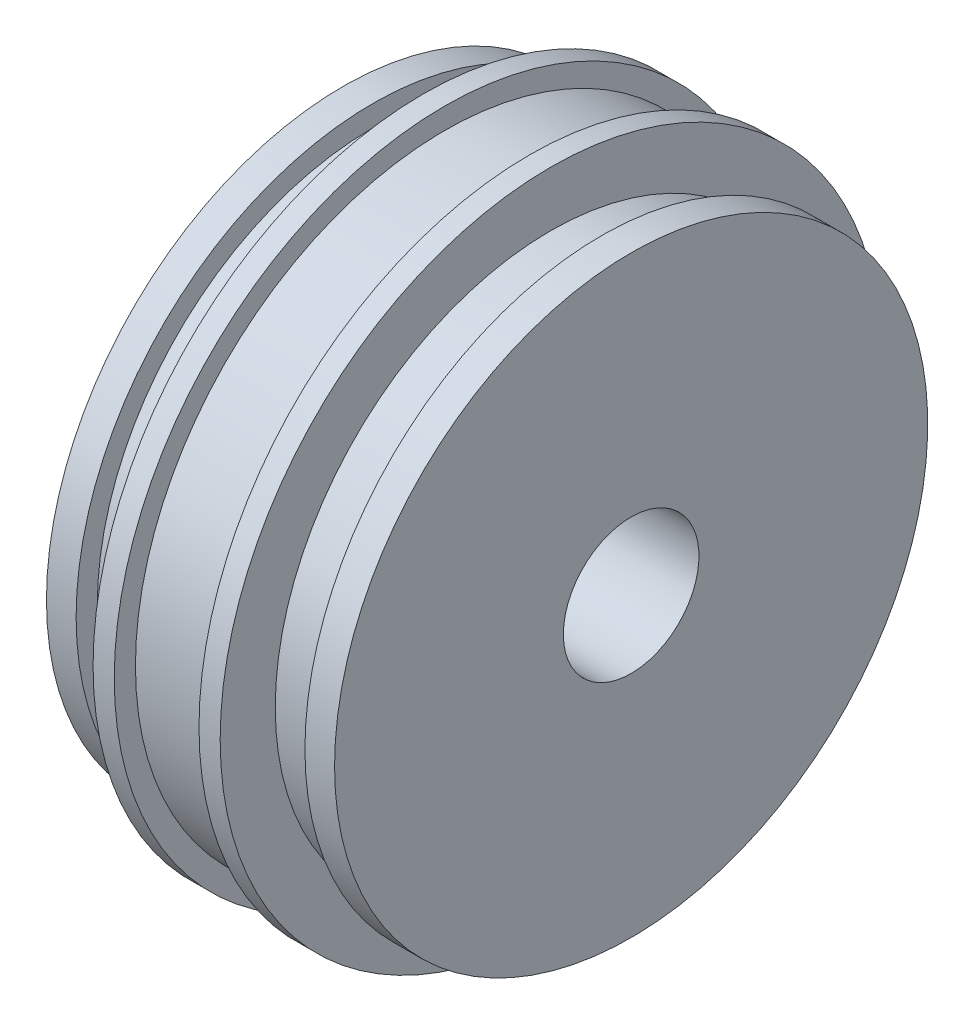
ISO-10303-21;
HEADER;
FILE_DESCRIPTION(('STEP AP214'),'2;1');
FILE_NAME('part.step','',(''),(''),'','','');
FILE_SCHEMA(('AUTOMOTIVE_DESIGN { 1 0 10303 214 1 1 1 1 }'));
ENDSEC;
DATA;
#1=APPLICATION_CONTEXT('core data for automotive mechanical design processes');
#2=APPLICATION_PROTOCOL_DEFINITION('international standard','automotive_design',2000,#1);
#3=PRODUCT_CONTEXT('',#1,'mechanical');
#4=PRODUCT('Part','Part','',(#3));
#5=PRODUCT_RELATED_PRODUCT_CATEGORY('part','',(#4));
#6=PRODUCT_DEFINITION_FORMATION('','',#4);
#7=PRODUCT_DEFINITION_CONTEXT('part definition',#1,'design');
#8=PRODUCT_DEFINITION('design','',#6,#7);
#9=PRODUCT_DEFINITION_SHAPE('','',#8);
#10=(LENGTH_UNIT() NAMED_UNIT(*) SI_UNIT(.MILLI.,.METRE.));
#11=(NAMED_UNIT(*) PLANE_ANGLE_UNIT() SI_UNIT($,.RADIAN.));
#12=(NAMED_UNIT(*) SI_UNIT($,.STERADIAN.) SOLID_ANGLE_UNIT());
#13=UNCERTAINTY_MEASURE_WITH_UNIT(LENGTH_MEASURE(1.E-05),#10,'distance_accuracy_value','');
#14=(GEOMETRIC_REPRESENTATION_CONTEXT(3) GLOBAL_UNCERTAINTY_ASSIGNED_CONTEXT((#13)) GLOBAL_UNIT_ASSIGNED_CONTEXT((#10,
#11,#12)) REPRESENTATION_CONTEXT('',''));
#15=CARTESIAN_POINT('',(0.,0.,0.));
#16=DIRECTION('',(0.,0.,1.));
#17=DIRECTION('',(1.,0.,0.));
#18=AXIS2_PLACEMENT_3D('',#15,#16,#17);
#19=CARTESIAN_POINT('',(-1.,0.500000000000007,0.));
#20=DIRECTION('',(-1.,0.,0.));
#21=DIRECTION('',(0.,0.,1.));
#22=AXIS2_PLACEMENT_3D('',#19,#20,#21);
#23=CYLINDRICAL_SURFACE('',#22,35.);
#24=CARTESIAN_POINT('',(7.34610074076811,0.500000000000007,0.));
#25=DIRECTION('',(-1.,0.,0.));
#26=DIRECTION('',(0.,0.,1.));
#27=AXIS2_PLACEMENT_3D('',#24,#25,#26);
#28=CIRCLE('',#27,35.);
#29=CARTESIAN_POINT('',(7.34610074076811,0.500000000000007,35.));
#30=VERTEX_POINT('',#29);
#31=EDGE_CURVE('E82',#30,#30,#28,.T.);
#32=ORIENTED_EDGE('',*,*,#31,.F.);
#33=EDGE_LOOP('',(#32));
#34=FACE_BOUND('',#33,.T.);
#35=CARTESIAN_POINT('',(10.8461007407681,0.500000000000007,0.));
#36=DIRECTION('',(-1.,0.,0.));
#37=DIRECTION('',(0.,0.,1.));
#38=AXIS2_PLACEMENT_3D('',#35,#36,#37);
#39=CIRCLE('',#38,35.);
#40=CARTESIAN_POINT('',(10.8461007407681,0.500000000000007,35.));
#41=VERTEX_POINT('',#40);
#42=EDGE_CURVE('E10',#41,#41,#39,.T.);
#43=ORIENTED_EDGE('',*,*,#42,.T.);
#44=EDGE_LOOP('',(#43));
#45=FACE_BOUND('',#44,.T.);
#46=ADVANCED_FACE('F30',(#34,#45),#23,.T.);
#47=CARTESIAN_POINT('',(10.8461007407681,35.5,0.));
#48=DIRECTION('',(-1.,0.,0.));
#49=DIRECTION('',(0.,0.,1.));
#50=AXIS2_PLACEMENT_3D('',#47,#48,#49);
#51=PLANE('',#50);
#52=ORIENTED_EDGE('',*,*,#42,.F.);
#53=EDGE_LOOP('',(#52));
#54=FACE_BOUND('',#53,.T.);
#55=CARTESIAN_POINT('',(10.8461007407681,0.500000000000007,0.));
#56=DIRECTION('',(-1.,0.,0.));
#57=DIRECTION('',(0.,0.,1.));
#58=AXIS2_PLACEMENT_3D('',#55,#56,#57);
#59=CIRCLE('',#58,32.5);
#60=CARTESIAN_POINT('',(10.8461007407681,0.500000000000007,32.5));
#61=VERTEX_POINT('',#60);
#62=EDGE_CURVE('E36',#61,#61,#59,.T.);
#63=ORIENTED_EDGE('',*,*,#62,.T.);
#64=EDGE_LOOP('',(#63));
#65=FACE_BOUND('',#64,.T.);
#66=ADVANCED_FACE('F89',(#54,#65),#51,.F.);
#67=CARTESIAN_POINT('',(-1.,0.500000000000007,0.));
#68=DIRECTION('',(-1.,0.,0.));
#69=DIRECTION('',(0.,0.,1.));
#70=AXIS2_PLACEMENT_3D('',#67,#68,#69);
#71=CYLINDRICAL_SURFACE('',#70,32.5);
#72=ORIENTED_EDGE('',*,*,#62,.F.);
#73=EDGE_LOOP('',(#72));
#74=FACE_BOUND('',#73,.T.);
#75=CARTESIAN_POINT('',(16.8461007407681,0.500000000000007,0.));
#76=DIRECTION('',(-1.,0.,0.));
#77=DIRECTION('',(0.,0.,1.));
#78=AXIS2_PLACEMENT_3D('',#75,#76,#77);
#79=CIRCLE('',#78,32.5);
#80=CARTESIAN_POINT('',(16.8461007407681,0.500000000000007,32.5));
#81=VERTEX_POINT('',#80);
#82=EDGE_CURVE('E40',#81,#81,#79,.T.);
#83=ORIENTED_EDGE('',*,*,#82,.T.);
#84=EDGE_LOOP('',(#83));
#85=FACE_BOUND('',#84,.T.);
#86=ADVANCED_FACE('F93',(#74,#85),#71,.T.);
#87=CARTESIAN_POINT('',(16.8461007407681,33.,0.));
#88=DIRECTION('',(1.,0.,0.));
#89=DIRECTION('',(0.,0.,-1.));
#90=AXIS2_PLACEMENT_3D('',#87,#88,#89);
#91=PLANE('',#90);
#92=ORIENTED_EDGE('',*,*,#82,.F.);
#93=EDGE_LOOP('',(#92));
#94=FACE_BOUND('',#93,.T.);
#95=CARTESIAN_POINT('',(16.8461007407681,0.500000000000007,0.));
#96=DIRECTION('',(-1.,0.,0.));
#97=DIRECTION('',(0.,0.,1.));
#98=AXIS2_PLACEMENT_3D('',#95,#96,#97);
#99=CIRCLE('',#98,39.);
#100=CARTESIAN_POINT('',(16.8461007407681,0.500000000000007,39.));
#101=VERTEX_POINT('',#100);
#102=EDGE_CURVE('E44',#101,#101,#99,.T.);
#103=ORIENTED_EDGE('',*,*,#102,.T.);
#104=EDGE_LOOP('',(#103));
#105=FACE_BOUND('',#104,.T.);
#106=ADVANCED_FACE('F98',(#94,#105),#91,.F.);
#107=CARTESIAN_POINT('',(-1.,0.500000000000007,0.));
#108=DIRECTION('',(-1.,0.,0.));
#109=DIRECTION('',(0.,0.,1.));
#110=AXIS2_PLACEMENT_3D('',#107,#108,#109);
#111=CYLINDRICAL_SURFACE('',#110,39.);
#112=ORIENTED_EDGE('',*,*,#102,.F.);
#113=EDGE_LOOP('',(#112));
#114=FACE_BOUND('',#113,.T.);
#115=CARTESIAN_POINT('',(19.3461007407681,0.500000000000007,0.));
#116=DIRECTION('',(-1.,0.,0.));
#117=DIRECTION('',(0.,0.,1.));
#118=AXIS2_PLACEMENT_3D('',#115,#116,#117);
#119=CIRCLE('',#118,39.);
#120=CARTESIAN_POINT('',(19.3461007407681,0.500000000000007,39.));
#121=VERTEX_POINT('',#120);
#122=EDGE_CURVE('E49',#121,#121,#119,.T.);
#123=ORIENTED_EDGE('',*,*,#122,.T.);
#124=EDGE_LOOP('',(#123));
#125=FACE_BOUND('',#124,.T.);
#126=ADVANCED_FACE('F104',(#114,#125),#111,.T.);
#127=CARTESIAN_POINT('',(19.3461007407681,39.5,0.));
#128=DIRECTION('',(-1.,0.,0.));
#129=DIRECTION('',(0.,0.,1.));
#130=AXIS2_PLACEMENT_3D('',#127,#128,#129);
#131=PLANE('',#130);
#132=ORIENTED_EDGE('',*,*,#122,.F.);
#133=EDGE_LOOP('',(#132));
#134=FACE_BOUND('',#133,.T.);
#135=CARTESIAN_POINT('',(19.3461007407681,0.500000000000007,0.));
#136=DIRECTION('',(-1.,0.,0.));
#137=DIRECTION('',(0.,0.,1.));
#138=AXIS2_PLACEMENT_3D('',#135,#136,#137);
#139=CIRCLE('',#138,36.5000000000001);
#140=CARTESIAN_POINT('',(19.3461007407681,0.500000000000007,36.5000000000001));
#141=VERTEX_POINT('',#140);
#142=EDGE_CURVE('E52',#141,#141,#139,.T.);
#143=ORIENTED_EDGE('',*,*,#142,.T.);
#144=EDGE_LOOP('',(#143));
#145=FACE_BOUND('',#144,.T.);
#146=ADVANCED_FACE('F108',(#134,#145),#131,.F.);
#147=CARTESIAN_POINT('',(-1.,0.500000000000007,0.));
#148=DIRECTION('',(-1.,0.,0.));
#149=DIRECTION('',(0.,0.,1.));
#150=AXIS2_PLACEMENT_3D('',#147,#148,#149);
#151=CYLINDRICAL_SURFACE('',#150,36.5000000000001);
#152=ORIENTED_EDGE('',*,*,#142,.F.);
#153=EDGE_LOOP('',(#152));
#154=FACE_BOUND('',#153,.T.);
#155=CARTESIAN_POINT('',(29.3461007407681,0.500000000000007,0.));
#156=DIRECTION('',(-1.,0.,0.));
#157=DIRECTION('',(0.,0.,1.));
#158=AXIS2_PLACEMENT_3D('',#155,#156,#157);
#159=CIRCLE('',#158,36.5000000000001);
#160=CARTESIAN_POINT('',(29.3461007407681,0.500000000000007,36.5000000000001));
#161=VERTEX_POINT('',#160);
#162=EDGE_CURVE('E55',#161,#161,#159,.T.);
#163=ORIENTED_EDGE('',*,*,#162,.T.);
#164=EDGE_LOOP('',(#163));
#165=FACE_BOUND('',#164,.T.);
#166=ADVANCED_FACE('F112',(#154,#165),#151,.T.);
#167=CARTESIAN_POINT('',(29.3461007407681,37.0000000000001,0.));
#168=DIRECTION('',(1.,0.,0.));
#169=DIRECTION('',(0.,0.,-1.));
#170=AXIS2_PLACEMENT_3D('',#167,#168,#169);
#171=PLANE('',#170);
#172=ORIENTED_EDGE('',*,*,#162,.F.);
#173=EDGE_LOOP('',(#172));
#174=FACE_BOUND('',#173,.T.);
#175=CARTESIAN_POINT('',(29.3461007407681,0.500000000000007,0.));
#176=DIRECTION('',(-1.,0.,0.));
#177=DIRECTION('',(0.,0.,1.));
#178=AXIS2_PLACEMENT_3D('',#175,#176,#177);
#179=CIRCLE('',#178,39.);
#180=CARTESIAN_POINT('',(29.3461007407681,0.500000000000007,39.));
#181=VERTEX_POINT('',#180);
#182=EDGE_CURVE('E58',#181,#181,#179,.T.);
#183=ORIENTED_EDGE('',*,*,#182,.T.);
#184=EDGE_LOOP('',(#183));
#185=FACE_BOUND('',#184,.T.);
#186=ADVANCED_FACE('F116',(#174,#185),#171,.F.);
#187=CARTESIAN_POINT('',(-1.,0.500000000000007,0.));
#188=DIRECTION('',(-1.,0.,0.));
#189=DIRECTION('',(0.,0.,1.));
#190=AXIS2_PLACEMENT_3D('',#187,#188,#189);
#191=CYLINDRICAL_SURFACE('',#190,39.);
#192=ORIENTED_EDGE('',*,*,#182,.F.);
#193=EDGE_LOOP('',(#192));
#194=FACE_BOUND('',#193,.T.);
#195=CARTESIAN_POINT('',(31.8461007407681,0.500000000000007,0.));
#196=DIRECTION('',(-1.,0.,0.));
#197=DIRECTION('',(0.,0.,1.));
#198=AXIS2_PLACEMENT_3D('',#195,#196,#197);
#199=CIRCLE('',#198,39.);
#200=CARTESIAN_POINT('',(31.8461007407681,0.500000000000007,39.));
#201=VERTEX_POINT('',#200);
#202=EDGE_CURVE('E61',#201,#201,#199,.T.);
#203=ORIENTED_EDGE('',*,*,#202,.T.);
#204=EDGE_LOOP('',(#203));
#205=FACE_BOUND('',#204,.T.);
#206=ADVANCED_FACE('F120',(#194,#205),#191,.T.);
#207=CARTESIAN_POINT('',(31.8461007407681,39.5,0.));
#208=DIRECTION('',(-1.,0.,0.));
#209=DIRECTION('',(0.,0.,1.));
#210=AXIS2_PLACEMENT_3D('',#207,#208,#209);
#211=PLANE('',#210);
#212=ORIENTED_EDGE('',*,*,#202,.F.);
#213=EDGE_LOOP('',(#212));
#214=FACE_BOUND('',#213,.T.);
#215=CARTESIAN_POINT('',(31.8461007407681,0.500000000000007,0.));
#216=DIRECTION('',(-1.,0.,0.));
#217=DIRECTION('',(0.,0.,1.));
#218=AXIS2_PLACEMENT_3D('',#215,#216,#217);
#219=CIRCLE('',#218,32.5);
#220=CARTESIAN_POINT('',(31.8461007407681,0.500000000000007,32.5));
#221=VERTEX_POINT('',#220);
#222=EDGE_CURVE('E64',#221,#221,#219,.T.);
#223=ORIENTED_EDGE('',*,*,#222,.T.);
#224=EDGE_LOOP('',(#223));
#225=FACE_BOUND('',#224,.T.);
#226=ADVANCED_FACE('F124',(#214,#225),#211,.F.);
#227=CARTESIAN_POINT('',(-1.,0.500000000000007,0.));
#228=DIRECTION('',(-1.,0.,0.));
#229=DIRECTION('',(0.,0.,1.));
#230=AXIS2_PLACEMENT_3D('',#227,#228,#229);
#231=CYLINDRICAL_SURFACE('',#230,32.5);
#232=ORIENTED_EDGE('',*,*,#222,.F.);
#233=EDGE_LOOP('',(#232));
#234=FACE_BOUND('',#233,.T.);
#235=CARTESIAN_POINT('',(37.8461007407681,0.500000000000007,0.));
#236=DIRECTION('',(-1.,0.,0.));
#237=DIRECTION('',(0.,0.,1.));
#238=AXIS2_PLACEMENT_3D('',#235,#236,#237);
#239=CIRCLE('',#238,32.5);
#240=CARTESIAN_POINT('',(37.8461007407681,0.500000000000007,32.5));
#241=VERTEX_POINT('',#240);
#242=EDGE_CURVE('E67',#241,#241,#239,.T.);
#243=ORIENTED_EDGE('',*,*,#242,.T.);
#244=EDGE_LOOP('',(#243));
#245=FACE_BOUND('',#244,.T.);
#246=ADVANCED_FACE('F128',(#234,#245),#231,.T.);
#247=CARTESIAN_POINT('',(37.8461007407681,33.,0.));
#248=DIRECTION('',(1.,0.,0.));
#249=DIRECTION('',(0.,0.,-1.));
#250=AXIS2_PLACEMENT_3D('',#247,#248,#249);
#251=PLANE('',#250);
#252=ORIENTED_EDGE('',*,*,#242,.F.);
#253=EDGE_LOOP('',(#252));
#254=FACE_BOUND('',#253,.T.);
#255=CARTESIAN_POINT('',(37.8461007407681,0.500000000000007,0.));
#256=DIRECTION('',(-1.,0.,0.));
#257=DIRECTION('',(0.,0.,1.));
#258=AXIS2_PLACEMENT_3D('',#255,#256,#257);
#259=CIRCLE('',#258,35.);
#260=CARTESIAN_POINT('',(37.8461007407681,0.500000000000007,35.));
#261=VERTEX_POINT('',#260);
#262=EDGE_CURVE('E70',#261,#261,#259,.T.);
#263=ORIENTED_EDGE('',*,*,#262,.T.);
#264=EDGE_LOOP('',(#263));
#265=FACE_BOUND('',#264,.T.);
#266=ADVANCED_FACE('F132',(#254,#265),#251,.F.);
#267=CARTESIAN_POINT('',(-1.,0.500000000000007,0.));
#268=DIRECTION('',(-1.,0.,0.));
#269=DIRECTION('',(0.,0.,1.));
#270=AXIS2_PLACEMENT_3D('',#267,#268,#269);
#271=CYLINDRICAL_SURFACE('',#270,35.);
#272=ORIENTED_EDGE('',*,*,#262,.F.);
#273=EDGE_LOOP('',(#272));
#274=FACE_BOUND('',#273,.T.);
#275=CARTESIAN_POINT('',(41.3461007407681,0.500000000000007,0.));
#276=DIRECTION('',(-1.,0.,0.));
#277=DIRECTION('',(0.,0.,1.));
#278=AXIS2_PLACEMENT_3D('',#275,#276,#277);
#279=CIRCLE('',#278,35.);
#280=CARTESIAN_POINT('',(41.3461007407681,0.500000000000007,35.));
#281=VERTEX_POINT('',#280);
#282=EDGE_CURVE('E73',#281,#281,#279,.T.);
#283=ORIENTED_EDGE('',*,*,#282,.T.);
#284=EDGE_LOOP('',(#283));
#285=FACE_BOUND('',#284,.T.);
#286=ADVANCED_FACE('F136',(#274,#285),#271,.T.);
#287=CARTESIAN_POINT('',(41.3461007407681,8.50000000000001,0.));
#288=DIRECTION('',(-1.,0.,0.));
#289=DIRECTION('',(0.,0.,1.));
#290=AXIS2_PLACEMENT_3D('',#287,#288,#289);
#291=PLANE('',#290);
#292=ORIENTED_EDGE('',*,*,#282,.F.);
#293=EDGE_LOOP('',(#292));
#294=FACE_BOUND('',#293,.T.);
#295=CARTESIAN_POINT('',(41.3461007407681,0.500000000000007,0.));
#296=DIRECTION('',(-1.,0.,0.));
#297=DIRECTION('',(0.,0.,1.));
#298=AXIS2_PLACEMENT_3D('',#295,#296,#297);
#299=CIRCLE('',#298,8.);
#300=CARTESIAN_POINT('',(41.3461007407681,0.500000000000007,8.));
#301=VERTEX_POINT('',#300);
#302=EDGE_CURVE('E76',#301,#301,#299,.T.);
#303=ORIENTED_EDGE('',*,*,#302,.T.);
#304=EDGE_LOOP('',(#303));
#305=FACE_BOUND('',#304,.T.);
#306=ADVANCED_FACE('F140',(#294,#305),#291,.F.);
#307=CARTESIAN_POINT('',(-1.,0.500000000000007,0.));
#308=DIRECTION('',(-1.,0.,0.));
#309=DIRECTION('',(0.,0.,1.));
#310=AXIS2_PLACEMENT_3D('',#307,#308,#309);
#311=CYLINDRICAL_SURFACE('',#310,8.);
#312=ORIENTED_EDGE('',*,*,#302,.F.);
#313=EDGE_LOOP('',(#312));
#314=FACE_BOUND('',#313,.T.);
#315=CARTESIAN_POINT('',(7.34610074076811,0.500000000000007,0.));
#316=DIRECTION('',(-1.,0.,0.));
#317=DIRECTION('',(0.,0.,1.));
#318=AXIS2_PLACEMENT_3D('',#315,#316,#317);
#319=CIRCLE('',#318,8.);
#320=CARTESIAN_POINT('',(7.34610074076811,0.500000000000007,8.));
#321=VERTEX_POINT('',#320);
#322=EDGE_CURVE('E79',#321,#321,#319,.T.);
#323=ORIENTED_EDGE('',*,*,#322,.T.);
#324=EDGE_LOOP('',(#323));
#325=FACE_BOUND('',#324,.T.);
#326=ADVANCED_FACE('F144',(#314,#325),#311,.F.);
#327=CARTESIAN_POINT('',(7.34610074076811,8.50000000000001,0.));
#328=DIRECTION('',(1.,0.,0.));
#329=DIRECTION('',(0.,0.,-1.));
#330=AXIS2_PLACEMENT_3D('',#327,#328,#329);
#331=PLANE('',#330);
#332=ORIENTED_EDGE('',*,*,#322,.F.);
#333=EDGE_LOOP('',(#332));
#334=FACE_BOUND('',#333,.T.);
#335=ORIENTED_EDGE('',*,*,#31,.T.);
#336=EDGE_LOOP('',(#335));
#337=FACE_BOUND('',#336,.T.);
#338=ADVANCED_FACE('F86',(#334,#337),#331,.F.);
#339=CLOSED_SHELL('',(#46,#66,#86,#106,#126,#146,#166,#186,#206,#226,#246,#266,#286,#306,#326,#338));
#340=MANIFOLD_SOLID_BREP('B2',#339);
#341=ADVANCED_BREP_SHAPE_REPRESENTATION('',(#18,#340),#14);
#342=SHAPE_DEFINITION_REPRESENTATION(#9,#341);
ENDSEC;
END-ISO-10303-21;
